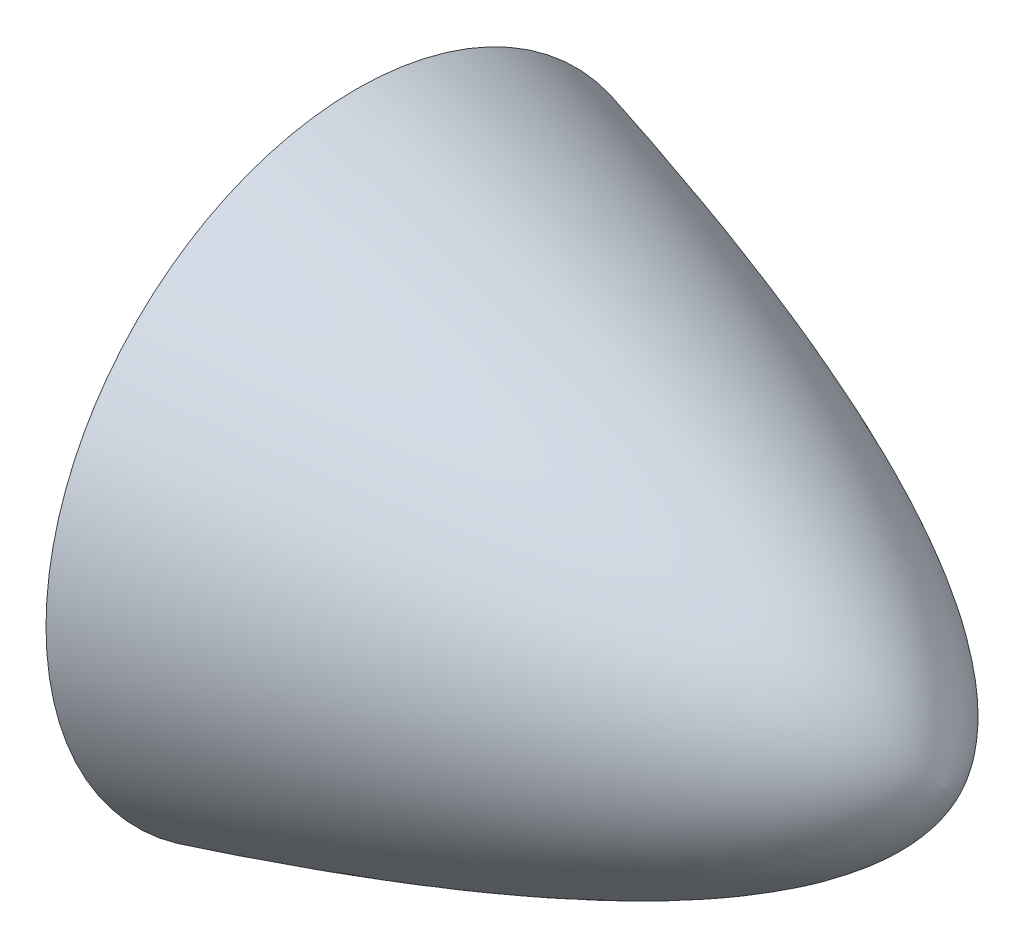
ISO-10303-21;
HEADER;
FILE_DESCRIPTION(('STEP AP214'),'2;1');
FILE_NAME('part.step','',(''),(''),'','','');
FILE_SCHEMA(('AUTOMOTIVE_DESIGN { 1 0 10303 214 1 1 1 1 }'));
ENDSEC;
DATA;
#1=APPLICATION_CONTEXT('core data for automotive mechanical design processes');
#2=APPLICATION_PROTOCOL_DEFINITION('international standard','automotive_design',2000,#1);
#3=PRODUCT_CONTEXT('',#1,'mechanical');
#4=PRODUCT('Part','Part','',(#3));
#5=PRODUCT_RELATED_PRODUCT_CATEGORY('part','',(#4));
#6=PRODUCT_DEFINITION_FORMATION('','',#4);
#7=PRODUCT_DEFINITION_CONTEXT('part definition',#1,'design');
#8=PRODUCT_DEFINITION('design','',#6,#7);
#9=PRODUCT_DEFINITION_SHAPE('','',#8);
#10=(LENGTH_UNIT() NAMED_UNIT(*) SI_UNIT(.MILLI.,.METRE.));
#11=(NAMED_UNIT(*) PLANE_ANGLE_UNIT() SI_UNIT($,.RADIAN.));
#12=(NAMED_UNIT(*) SI_UNIT($,.STERADIAN.) SOLID_ANGLE_UNIT());
#13=UNCERTAINTY_MEASURE_WITH_UNIT(LENGTH_MEASURE(1.E-05),#10,'distance_accuracy_value','');
#14=(GEOMETRIC_REPRESENTATION_CONTEXT(3) GLOBAL_UNCERTAINTY_ASSIGNED_CONTEXT((#13)) GLOBAL_UNIT_ASSIGNED_CONTEXT((#10,
#11,#12)) REPRESENTATION_CONTEXT('',''));
#15=CARTESIAN_POINT('',(0.,0.,0.));
#16=DIRECTION('',(0.,0.,1.));
#17=DIRECTION('',(1.,0.,0.));
#18=AXIS2_PLACEMENT_3D('',#15,#16,#17);
#19=CARTESIAN_POINT('',(36.1684630106806,0.,0.));
#20=CARTESIAN_POINT('',(34.5087987010394,9.84129313223685,0.));
#21=CARTESIAN_POINT('',(0.,19.05,0.));
#22=B_SPLINE_CURVE_WITH_KNOTS('',2,(#19,#20,#21),.UNSPECIFIED.,.F.,.F.,(3,3),(0.,1.),.UNSPECIFIED.);
#23=CARTESIAN_POINT('',(0.,0.,0.));
#24=DIRECTION('',(-1.,0.,0.));
#25=AXIS1_PLACEMENT('',#23,#24);
#26=SURFACE_OF_REVOLUTION('',#22,#25);
#27=CARTESIAN_POINT('',(0.,0.,0.));
#28=DIRECTION('',(-1.,0.,0.));
#29=DIRECTION('',(0.,0.,1.));
#30=AXIS2_PLACEMENT_3D('',#27,#28,#29);
#31=CIRCLE('',#30,19.05);
#32=CARTESIAN_POINT('',(0.,0.,19.05));
#33=VERTEX_POINT('',#32);
#34=EDGE_CURVE('E11',#33,#33,#31,.T.);
#35=ORIENTED_EDGE('',*,*,#34,.F.);
#36=EDGE_LOOP('',(#35));
#37=FACE_BOUND('',#36,.T.);
#38=CARTESIAN_POINT('',(36.1684630106806,0.,0.));
#39=VERTEX_POINT('',#38);
#40=VERTEX_LOOP('',#39);
#41=FACE_BOUND('',#40,.T.);
#42=ADVANCED_FACE('F39',(#37,#41),#26,.T.);
#43=CARTESIAN_POINT('',(0.,0.,0.));
#44=DIRECTION('',(1.,0.,0.));
#45=DIRECTION('',(0.,0.,-1.));
#46=AXIS2_PLACEMENT_3D('',#43,#44,#45);
#47=PLANE('',#46);
#48=ORIENTED_EDGE('',*,*,#34,.T.);
#49=EDGE_LOOP('',(#48));
#50=FACE_BOUND('',#49,.T.);
#51=ADVANCED_FACE('F48',(#50),#47,.F.);
#52=CLOSED_SHELL('',(#42,#51));
#53=MANIFOLD_SOLID_BREP('B2',#52);
#54=ADVANCED_BREP_SHAPE_REPRESENTATION('',(#18,#53),#14);
#55=SHAPE_DEFINITION_REPRESENTATION(#9,#54);
ENDSEC;
END-ISO-10303-21;
